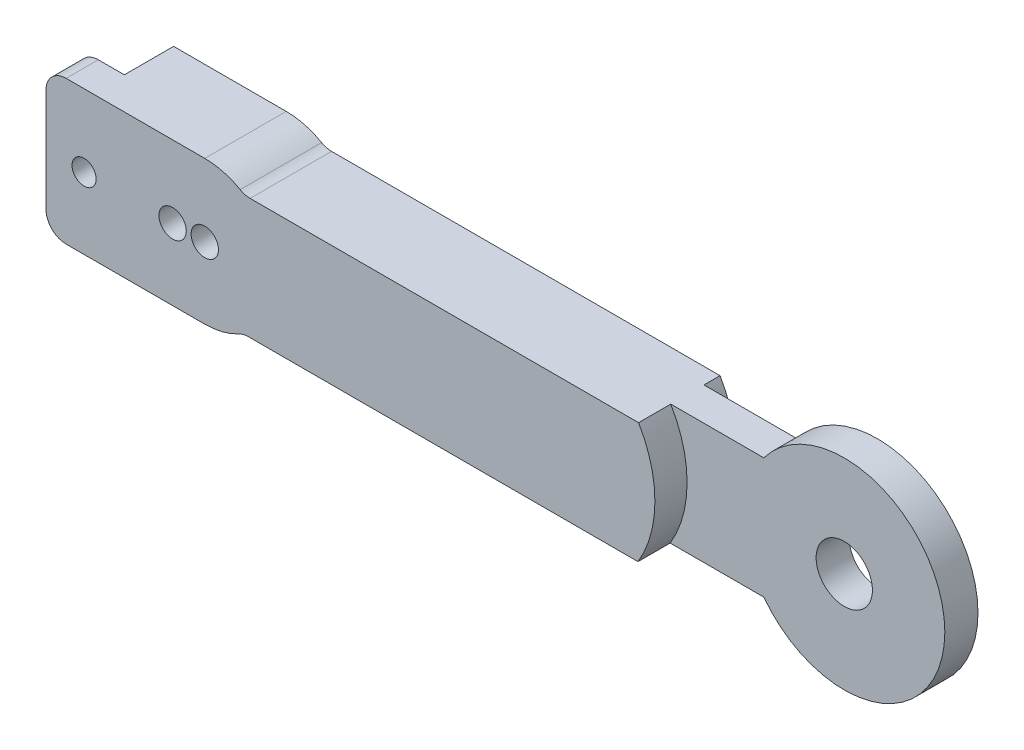
ISO-10303-21;
HEADER;
FILE_DESCRIPTION(('STEP AP214'),'2;1');
FILE_NAME('part.step','',(''),(''),'','','');
FILE_SCHEMA(('AUTOMOTIVE_DESIGN { 1 0 10303 214 1 1 1 1 }'));
ENDSEC;
DATA;
#1=APPLICATION_CONTEXT('core data for automotive mechanical design processes');
#2=APPLICATION_PROTOCOL_DEFINITION('international standard','automotive_design',2000,#1);
#3=PRODUCT_CONTEXT('',#1,'mechanical');
#4=PRODUCT('Part','Part','',(#3));
#5=PRODUCT_RELATED_PRODUCT_CATEGORY('part','',(#4));
#6=PRODUCT_DEFINITION_FORMATION('','',#4);
#7=PRODUCT_DEFINITION_CONTEXT('part definition',#1,'design');
#8=PRODUCT_DEFINITION('design','',#6,#7);
#9=PRODUCT_DEFINITION_SHAPE('','',#8);
#10=(LENGTH_UNIT() NAMED_UNIT(*) SI_UNIT(.MILLI.,.METRE.));
#11=(NAMED_UNIT(*) PLANE_ANGLE_UNIT() SI_UNIT($,.RADIAN.));
#12=(NAMED_UNIT(*) SI_UNIT($,.STERADIAN.) SOLID_ANGLE_UNIT());
#13=UNCERTAINTY_MEASURE_WITH_UNIT(LENGTH_MEASURE(1.E-05),#10,'distance_accuracy_value','');
#14=(GEOMETRIC_REPRESENTATION_CONTEXT(3) GLOBAL_UNCERTAINTY_ASSIGNED_CONTEXT((#13)) GLOBAL_UNIT_ASSIGNED_CONTEXT((#10,
#11,#12)) REPRESENTATION_CONTEXT('',''));
#15=CARTESIAN_POINT('',(0.,0.,0.));
#16=DIRECTION('',(0.,0.,1.));
#17=DIRECTION('',(1.,0.,0.));
#18=AXIS2_PLACEMENT_3D('',#15,#16,#17);
#19=CARTESIAN_POINT('',(14.,3.925,4.125));
#20=DIRECTION('',(0.,0.,-1.));
#21=DIRECTION('',(-1.,0.,0.));
#22=AXIS2_PLACEMENT_3D('',#19,#20,#21);
#23=CYLINDRICAL_SURFACE('',#22,8.925);
#24=DIRECTION('',(0.,0.,-1.));
#25=VECTOR('',#24,1.);
#26=CARTESIAN_POINT('',(18.2268147702944,-3.93564004376367,4.125));
#27=LINE('',#26,#25);
#28=CARTESIAN_POINT('',(18.2268147702944,-3.93564004376367,-2.));
#29=VERTEX_POINT('',#28);
#30=CARTESIAN_POINT('',(18.2268147702944,-3.93564004376367,8.125));
#31=VERTEX_POINT('',#30);
#32=EDGE_CURVE('E55',#29,#31,#27,.F.);
#33=ORIENTED_EDGE('',*,*,#32,.T.);
#34=CARTESIAN_POINT('',(14.,3.925,8.125));
#35=DIRECTION('',(0.,0.,1.));
#36=DIRECTION('',(1.,0.,0.));
#37=AXIS2_PLACEMENT_3D('',#34,#35,#36);
#38=CIRCLE('',#37,8.925);
#39=CARTESIAN_POINT('',(14.,-5.,8.125));
#40=VERTEX_POINT('',#39);
#41=EDGE_CURVE('E347',#40,#31,#38,.T.);
#42=ORIENTED_EDGE('',*,*,#41,.F.);
#43=DIRECTION('',(0.,0.,-1.));
#44=VECTOR('',#43,1.);
#45=CARTESIAN_POINT('',(14.,-5.,4.125));
#46=LINE('',#45,#44);
#47=CARTESIAN_POINT('',(14.,-5.,-2.));
#48=VERTEX_POINT('',#47);
#49=EDGE_CURVE('E513',#40,#48,#46,.T.);
#50=ORIENTED_EDGE('',*,*,#49,.T.);
#51=CARTESIAN_POINT('',(14.,3.925,-2.));
#52=DIRECTION('',(0.,0.,-1.));
#53=DIRECTION('',(-1.,0.,0.));
#54=AXIS2_PLACEMENT_3D('',#51,#52,#53);
#55=CIRCLE('',#54,8.925);
#56=EDGE_CURVE('E423',#29,#48,#55,.T.);
#57=ORIENTED_EDGE('',*,*,#56,.F.);
#58=EDGE_LOOP('',(#33,#42,#50,#57));
#59=FACE_BOUND('',#58,.T.);
#60=ADVANCED_FACE('F45',(#59),#23,.T.);
#61=CARTESIAN_POINT('',(14.,3.925,8.125));
#62=DIRECTION('',(0.,0.,1.));
#63=DIRECTION('',(1.,0.,0.));
#64=AXIS2_PLACEMENT_3D('',#61,#62,#63);
#65=CIRCLE('',#64,8.925);
#66=CARTESIAN_POINT('',(18.4035865959508,11.6879923413567,8.125));
#67=VERTEX_POINT('',#66);
#68=CARTESIAN_POINT('',(14.,12.85,8.125));
#69=VERTEX_POINT('',#68);
#70=EDGE_CURVE('E351',#67,#69,#65,.T.);
#71=ORIENTED_EDGE('',*,*,#70,.F.);
#72=DIRECTION('',(0.,0.,-1.));
#73=VECTOR('',#72,1.);
#74=CARTESIAN_POINT('',(18.4035865959508,11.6879923413567,4.125));
#75=LINE('',#74,#73);
#76=CARTESIAN_POINT('',(18.4035865959508,11.6879923413567,-2.));
#77=VERTEX_POINT('',#76);
#78=EDGE_CURVE('E62',#67,#77,#75,.T.);
#79=ORIENTED_EDGE('',*,*,#78,.T.);
#80=CARTESIAN_POINT('',(14.,12.85,-2.));
#81=VERTEX_POINT('',#80);
#82=EDGE_CURVE('E424',#81,#77,#55,.T.);
#83=ORIENTED_EDGE('',*,*,#82,.F.);
#84=DIRECTION('',(0.,0.,-1.));
#85=VECTOR('',#84,1.);
#86=CARTESIAN_POINT('',(14.,12.85,4.125));
#87=LINE('',#86,#85);
#88=EDGE_CURVE('E510',#69,#81,#87,.T.);
#89=ORIENTED_EDGE('',*,*,#88,.F.);
#90=EDGE_LOOP('',(#71,#79,#83,#89));
#91=FACE_BOUND('',#90,.T.);
#92=ADVANCED_FACE('F562',(#91),#23,.T.);
#93=CARTESIAN_POINT('',(89.4999999999934,3.8625,0.));
#94=DIRECTION('',(0.,0.,-1.));
#95=DIRECTION('',(-1.,0.,0.));
#96=AXIS2_PLACEMENT_3D('',#93,#94,#95);
#97=PLANE('',#96);
#98=CARTESIAN_POINT('',(89.4999999999934,3.8625,0.));
#99=DIRECTION('',(0.,0.,-1.));
#100=DIRECTION('',(-1.,0.,0.));
#101=AXIS2_PLACEMENT_3D('',#98,#99,#100);
#102=CIRCLE('',#101,3.50000000000001);
#103=CARTESIAN_POINT('',(85.9999999999934,3.8625,0.));
#104=VERTEX_POINT('',#103);
#105=EDGE_CURVE('E49',#104,#104,#102,.T.);
#106=ORIENTED_EDGE('',*,*,#105,.F.);
#107=EDGE_LOOP('',(#106));
#108=FACE_BOUND('',#107,.T.);
#109=DIRECTION('',(1.,0.,0.));
#110=VECTOR('',#109,1.);
#111=CARTESIAN_POINT('',(89.5,-3.63750000000001,0.));
#112=LINE('',#111,#110);
#113=CARTESIAN_POINT('',(67.8573018061817,-3.6375,0.));
#114=VERTEX_POINT('',#113);
#115=CARTESIAN_POINT('',(79.4999999999934,-3.63750000000001,0.));
#116=VERTEX_POINT('',#115);
#117=EDGE_CURVE('E305',#114,#116,#112,.T.);
#118=ORIENTED_EDGE('',*,*,#117,.F.);
#119=CARTESIAN_POINT('',(55.3074745937747,3.925,0.));
#120=DIRECTION('',(0.,0.,-1.));
#121=DIRECTION('',(-1.,0.,0.));
#122=AXIS2_PLACEMENT_3D('',#119,#120,#121);
#123=CIRCLE('',#122,14.6522888761883);
#124=CARTESIAN_POINT('',(67.931783012903,11.3625,0.));
#125=VERTEX_POINT('',#124);
#126=EDGE_CURVE('E258',#125,#114,#123,.T.);
#127=ORIENTED_EDGE('',*,*,#126,.F.);
#128=DIRECTION('',(-1.,0.,0.));
#129=VECTOR('',#128,1.);
#130=CARTESIAN_POINT('',(89.5,11.3625,0.));
#131=LINE('',#130,#129);
#132=CARTESIAN_POINT('',(79.4999999999934,11.3625,0.));
#133=VERTEX_POINT('',#132);
#134=EDGE_CURVE('E309',#133,#125,#131,.T.);
#135=ORIENTED_EDGE('',*,*,#134,.F.);
#136=CARTESIAN_POINT('',(89.4999999999934,3.8625,0.));
#137=DIRECTION('',(0.,0.,-1.));
#138=DIRECTION('',(-1.,0.,0.));
#139=AXIS2_PLACEMENT_3D('',#136,#137,#138);
#140=CIRCLE('',#139,12.5);
#141=EDGE_CURVE('E287',#133,#116,#140,.T.);
#142=ORIENTED_EDGE('',*,*,#141,.T.);
#143=EDGE_LOOP('',(#118,#127,#135,#142));
#144=FACE_BOUND('',#143,.T.);
#145=ADVANCED_FACE('F549',(#108,#144),#97,.T.);
#146=CARTESIAN_POINT('',(0.,-5.,4.125));
#147=DIRECTION('',(1.,0.,0.));
#148=DIRECTION('',(0.,1.,0.));
#149=AXIS2_PLACEMENT_3D('',#146,#147,#148);
#150=PLANE('',#149);
#151=DIRECTION('',(0.,0.,-1.));
#152=VECTOR('',#151,1.);
#153=CARTESIAN_POINT('',(0.,0.,4.125));
#154=LINE('',#153,#152);
#155=CARTESIAN_POINT('',(0.,0.,4.125));
#156=VERTEX_POINT('',#155);
#157=CARTESIAN_POINT('',(0.,0.,0.));
#158=VERTEX_POINT('',#157);
#159=EDGE_CURVE('E481',#156,#158,#154,.T.);
#160=ORIENTED_EDGE('',*,*,#159,.T.);
#161=DIRECTION('',(0.,1.,0.));
#162=VECTOR('',#161,1.);
#163=CARTESIAN_POINT('',(0.,1.1125,0.));
#164=LINE('',#163,#162);
#165=CARTESIAN_POINT('',(0.,1.1125,0.));
#166=VERTEX_POINT('',#165);
#167=EDGE_CURVE('E397',#158,#166,#164,.T.);
#168=ORIENTED_EDGE('',*,*,#167,.T.);
#169=DIRECTION('',(0.,0.,1.));
#170=VECTOR('',#169,1.);
#171=CARTESIAN_POINT('',(0.,1.1125,-2.));
#172=LINE('',#171,#170);
#173=CARTESIAN_POINT('',(0.,1.1125,-2.));
#174=VERTEX_POINT('',#173);
#175=EDGE_CURVE('E455',#174,#166,#172,.T.);
#176=ORIENTED_EDGE('',*,*,#175,.F.);
#177=DIRECTION('',(0.,1.,0.));
#178=VECTOR('',#177,1.);
#179=CARTESIAN_POINT('',(0.,-5.,-2.));
#180=LINE('',#179,#178);
#181=CARTESIAN_POINT('',(0.,-5.,-2.));
#182=VERTEX_POINT('',#181);
#183=EDGE_CURVE('E402',#182,#174,#180,.T.);
#184=ORIENTED_EDGE('',*,*,#183,.F.);
#185=DIRECTION('',(0.,0.,-1.));
#186=VECTOR('',#185,1.);
#187=CARTESIAN_POINT('',(0.,-5.,4.125));
#188=LINE('',#187,#186);
#189=CARTESIAN_POINT('',(0.,-5.,4.125));
#190=VERTEX_POINT('',#189);
#191=EDGE_CURVE('E517',#190,#182,#188,.T.);
#192=ORIENTED_EDGE('',*,*,#191,.F.);
#193=DIRECTION('',(0.,-1.,0.));
#194=VECTOR('',#193,1.);
#195=CARTESIAN_POINT('',(0.,-5.,4.125));
#196=LINE('',#195,#194);
#197=EDGE_CURVE('E460',#156,#190,#196,.T.);
#198=ORIENTED_EDGE('',*,*,#197,.F.);
#199=EDGE_LOOP('',(#160,#168,#176,#184,#192,#198));
#200=FACE_BOUND('',#199,.T.);
#201=ADVANCED_FACE('F591',(#200),#150,.F.);
#202=CARTESIAN_POINT('',(14.,-5.,4.125));
#203=DIRECTION('',(0.,1.,0.));
#204=DIRECTION('',(-1.,0.,0.));
#205=AXIS2_PLACEMENT_3D('',#202,#203,#204);
#206=PLANE('',#205);
#207=ORIENTED_EDGE('',*,*,#191,.T.);
#208=DIRECTION('',(-1.,0.,0.));
#209=VECTOR('',#208,1.);
#210=CARTESIAN_POINT('',(14.,-5.,-2.));
#211=LINE('',#210,#209);
#212=EDGE_CURVE('E398',#48,#182,#211,.T.);
#213=ORIENTED_EDGE('',*,*,#212,.F.);
#214=ORIENTED_EDGE('',*,*,#49,.F.);
#215=DIRECTION('',(1.,0.,0.));
#216=VECTOR('',#215,1.);
#217=CARTESIAN_POINT('',(0.,-5.,8.125));
#218=LINE('',#217,#216);
#219=CARTESIAN_POINT('',(-3.23886907207625,-5.,8.125));
#220=VERTEX_POINT('',#219);
#221=EDGE_CURVE('E343',#220,#40,#218,.T.);
#222=ORIENTED_EDGE('',*,*,#221,.F.);
#223=DIRECTION('',(0.,0.,-1.));
#224=VECTOR('',#223,1.);
#225=CARTESIAN_POINT('',(-3.23886907207625,-5.,8.125));
#226=LINE('',#225,#224);
#227=CARTESIAN_POINT('',(-3.23886907207625,-5.,4.125));
#228=VERTEX_POINT('',#227);
#229=EDGE_CURVE('E367',#220,#228,#226,.T.);
#230=ORIENTED_EDGE('',*,*,#229,.T.);
#231=DIRECTION('',(1.,0.,0.));
#232=VECTOR('',#231,1.);
#233=CARTESIAN_POINT('',(-3.23886907207625,-5.,4.125));
#234=LINE('',#233,#232);
#235=EDGE_CURVE('E348',#228,#190,#234,.T.);
#236=ORIENTED_EDGE('',*,*,#235,.T.);
#237=EDGE_LOOP('',(#207,#213,#214,#222,#230,#236));
#238=FACE_BOUND('',#237,.T.);
#239=ADVANCED_FACE('F585',(#238),#206,.F.);
#240=CARTESIAN_POINT('',(0.,12.85,4.125));
#241=DIRECTION('',(0.,-1.,0.));
#242=DIRECTION('',(1.,0.,0.));
#243=AXIS2_PLACEMENT_3D('',#240,#241,#242);
#244=PLANE('',#243);
#245=ORIENTED_EDGE('',*,*,#88,.T.);
#246=DIRECTION('',(1.,0.,0.));
#247=VECTOR('',#246,1.);
#248=CARTESIAN_POINT('',(0.,12.85,-2.));
#249=LINE('',#248,#247);
#250=CARTESIAN_POINT('',(0.,12.85,-2.));
#251=VERTEX_POINT('',#250);
#252=EDGE_CURVE('E419',#251,#81,#249,.T.);
#253=ORIENTED_EDGE('',*,*,#252,.F.);
#254=DIRECTION('',(0.,0.,-1.));
#255=VECTOR('',#254,1.);
#256=CARTESIAN_POINT('',(0.,12.85,4.125));
#257=LINE('',#256,#255);
#258=CARTESIAN_POINT('',(0.,12.85,4.125));
#259=VERTEX_POINT('',#258);
#260=EDGE_CURVE('E507',#259,#251,#257,.T.);
#261=ORIENTED_EDGE('',*,*,#260,.F.);
#262=DIRECTION('',(-1.,0.,0.));
#263=VECTOR('',#262,1.);
#264=CARTESIAN_POINT('',(0.,12.85,4.125));
#265=LINE('',#264,#263);
#266=CARTESIAN_POINT('',(-3.23886907207625,12.85,4.125));
#267=VERTEX_POINT('',#266);
#268=EDGE_CURVE('E339',#259,#267,#265,.T.);
#269=ORIENTED_EDGE('',*,*,#268,.T.);
#270=DIRECTION('',(0.,0.,-1.));
#271=VECTOR('',#270,1.);
#272=CARTESIAN_POINT('',(-3.23886907207625,12.85,8.125));
#273=LINE('',#272,#271);
#274=CARTESIAN_POINT('',(-3.23886907207625,12.85,8.125));
#275=VERTEX_POINT('',#274);
#276=EDGE_CURVE('E393',#275,#267,#273,.T.);
#277=ORIENTED_EDGE('',*,*,#276,.F.);
#278=DIRECTION('',(-1.,0.,0.));
#279=VECTOR('',#278,1.);
#280=CARTESIAN_POINT('',(14.,12.85,8.125));
#281=LINE('',#280,#279);
#282=EDGE_CURVE('E354',#69,#275,#281,.T.);
#283=ORIENTED_EDGE('',*,*,#282,.F.);
#284=EDGE_LOOP('',(#245,#253,#261,#269,#277,#283));
#285=FACE_BOUND('',#284,.T.);
#286=ADVANCED_FACE('F568',(#285),#244,.F.);
#287=CARTESIAN_POINT('',(0.,7.85,4.125));
#288=DIRECTION('',(1.,0.,0.));
#289=DIRECTION('',(0.,0.,-1.));
#290=AXIS2_PLACEMENT_3D('',#287,#288,#289);
#291=PLANE('',#290);
#292=ORIENTED_EDGE('',*,*,#260,.T.);
#293=DIRECTION('',(0.,1.,0.));
#294=VECTOR('',#293,1.);
#295=CARTESIAN_POINT('',(0.,6.7375,-2.));
#296=LINE('',#295,#294);
#297=CARTESIAN_POINT('',(0.,6.7375,-2.));
#298=VERTEX_POINT('',#297);
#299=EDGE_CURVE('E415',#298,#251,#296,.T.);
#300=ORIENTED_EDGE('',*,*,#299,.F.);
#301=DIRECTION('',(0.,0.,1.));
#302=VECTOR('',#301,1.);
#303=CARTESIAN_POINT('',(0.,6.7375,-2.));
#304=LINE('',#303,#302);
#305=CARTESIAN_POINT('',(0.,6.7375,0.));
#306=VERTEX_POINT('',#305);
#307=EDGE_CURVE('E428',#298,#306,#304,.T.);
#308=ORIENTED_EDGE('',*,*,#307,.T.);
#309=DIRECTION('',(0.,1.,0.));
#310=VECTOR('',#309,1.);
#311=CARTESIAN_POINT('',(0.,7.85,0.));
#312=LINE('',#311,#310);
#313=CARTESIAN_POINT('',(0.,7.85,0.));
#314=VERTEX_POINT('',#313);
#315=EDGE_CURVE('E403',#306,#314,#312,.T.);
#316=ORIENTED_EDGE('',*,*,#315,.T.);
#317=DIRECTION('',(0.,0.,-1.));
#318=VECTOR('',#317,1.);
#319=CARTESIAN_POINT('',(0.,7.85,4.125));
#320=LINE('',#319,#318);
#321=CARTESIAN_POINT('',(0.,7.85,4.125));
#322=VERTEX_POINT('',#321);
#323=EDGE_CURVE('E503',#322,#314,#320,.T.);
#324=ORIENTED_EDGE('',*,*,#323,.F.);
#325=DIRECTION('',(0.,-1.,0.));
#326=VECTOR('',#325,1.);
#327=CARTESIAN_POINT('',(0.,7.85,4.125));
#328=LINE('',#327,#326);
#329=EDGE_CURVE('E464',#259,#322,#328,.T.);
#330=ORIENTED_EDGE('',*,*,#329,.F.);
#331=EDGE_LOOP('',(#292,#300,#308,#316,#324,#330));
#332=FACE_BOUND('',#331,.T.);
#333=ADVANCED_FACE('F684',(#332),#291,.F.);
#334=CARTESIAN_POINT('',(14.,7.85,4.125));
#335=DIRECTION('',(0.,1.,0.));
#336=DIRECTION('',(-1.,0.,0.));
#337=AXIS2_PLACEMENT_3D('',#334,#335,#336);
#338=PLANE('',#337);
#339=DIRECTION('',(1.,0.,0.));
#340=VECTOR('',#339,1.);
#341=CARTESIAN_POINT('',(14.,7.85,0.));
#342=LINE('',#341,#340);
#343=CARTESIAN_POINT('',(14.,7.85,0.));
#344=VERTEX_POINT('',#343);
#345=EDGE_CURVE('E459',#314,#344,#342,.T.);
#346=ORIENTED_EDGE('',*,*,#345,.T.);
#347=DIRECTION('',(0.,0.,-1.));
#348=VECTOR('',#347,1.);
#349=CARTESIAN_POINT('',(14.,7.85,4.125));
#350=LINE('',#349,#348);
#351=CARTESIAN_POINT('',(14.,7.85,4.125));
#352=VERTEX_POINT('',#351);
#353=EDGE_CURVE('E499',#352,#344,#350,.T.);
#354=ORIENTED_EDGE('',*,*,#353,.F.);
#355=DIRECTION('',(1.,0.,0.));
#356=VECTOR('',#355,1.);
#357=CARTESIAN_POINT('',(14.,7.85,4.125));
#358=LINE('',#357,#356);
#359=EDGE_CURVE('E469',#322,#352,#358,.T.);
#360=ORIENTED_EDGE('',*,*,#359,.F.);
#361=ORIENTED_EDGE('',*,*,#323,.T.);
#362=EDGE_LOOP('',(#346,#354,#360,#361));
#363=FACE_BOUND('',#362,.T.);
#364=ADVANCED_FACE('F681',(#363),#338,.F.);
#365=CARTESIAN_POINT('',(14.,3.925,4.125));
#366=DIRECTION('',(0.,0.,-1.));
#367=DIRECTION('',(-1.,0.,0.));
#368=AXIS2_PLACEMENT_3D('',#365,#366,#367);
#369=CYLINDRICAL_SURFACE('',#368,3.925);
#370=CARTESIAN_POINT('',(14.,3.925,0.));
#371=DIRECTION('',(0.,0.,-1.));
#372=DIRECTION('',(1.,0.,0.));
#373=AXIS2_PLACEMENT_3D('',#370,#371,#372);
#374=CIRCLE('',#373,3.925);
#375=CARTESIAN_POINT('',(14.,0.,0.));
#376=VERTEX_POINT('',#375);
#377=EDGE_CURVE('E485',#344,#376,#374,.T.);
#378=ORIENTED_EDGE('',*,*,#377,.T.);
#379=DIRECTION('',(0.,0.,-1.));
#380=VECTOR('',#379,1.);
#381=CARTESIAN_POINT('',(14.,0.,4.125));
#382=LINE('',#381,#380);
#383=CARTESIAN_POINT('',(14.,0.,4.125));
#384=VERTEX_POINT('',#383);
#385=EDGE_CURVE('E495',#384,#376,#382,.T.);
#386=ORIENTED_EDGE('',*,*,#385,.F.);
#387=CARTESIAN_POINT('',(14.,3.925,4.125));
#388=DIRECTION('',(0.,0.,-1.));
#389=DIRECTION('',(1.,0.,0.));
#390=AXIS2_PLACEMENT_3D('',#387,#388,#389);
#391=CIRCLE('',#390,3.925);
#392=EDGE_CURVE('E473',#352,#384,#391,.T.);
#393=ORIENTED_EDGE('',*,*,#392,.F.);
#394=ORIENTED_EDGE('',*,*,#353,.T.);
#395=EDGE_LOOP('',(#378,#386,#393,#394));
#396=FACE_BOUND('',#395,.T.);
#397=ADVANCED_FACE('F677',(#396),#369,.F.);
#398=CARTESIAN_POINT('',(0.,0.,4.125));
#399=DIRECTION('',(0.,-1.,0.));
#400=DIRECTION('',(0.,0.,-1.));
#401=AXIS2_PLACEMENT_3D('',#398,#399,#400);
#402=PLANE('',#401);
#403=DIRECTION('',(-1.,0.,0.));
#404=VECTOR('',#403,1.);
#405=CARTESIAN_POINT('',(0.,0.,0.));
#406=LINE('',#405,#404);
#407=EDGE_CURVE('E465',#376,#158,#406,.T.);
#408=ORIENTED_EDGE('',*,*,#407,.T.);
#409=ORIENTED_EDGE('',*,*,#159,.F.);
#410=DIRECTION('',(-1.,0.,0.));
#411=VECTOR('',#410,1.);
#412=CARTESIAN_POINT('',(0.,0.,4.125));
#413=LINE('',#412,#411);
#414=EDGE_CURVE('E477',#384,#156,#413,.T.);
#415=ORIENTED_EDGE('',*,*,#414,.F.);
#416=ORIENTED_EDGE('',*,*,#385,.T.);
#417=EDGE_LOOP('',(#408,#409,#415,#416));
#418=FACE_BOUND('',#417,.T.);
#419=ADVANCED_FACE('F674',(#418),#402,.F.);
#420=CARTESIAN_POINT('',(14.,3.925,4.125));
#421=DIRECTION('',(0.,0.,1.));
#422=DIRECTION('',(1.,0.,0.));
#423=AXIS2_PLACEMENT_3D('',#420,#421,#422);
#424=PLANE('',#423);
#425=DIRECTION('',(-1.,0.,0.));
#426=VECTOR('',#425,1.);
#427=CARTESIAN_POINT('',(89.5,11.3625,4.125));
#428=LINE('',#427,#426);
#429=CARTESIAN_POINT('',(79.4999999999934,11.3625,4.125));
#430=VERTEX_POINT('',#429);
#431=CARTESIAN_POINT('',(67.931783012903,11.3625,4.125));
#432=VERTEX_POINT('',#431);
#433=EDGE_CURVE('E313',#430,#432,#428,.T.);
#434=ORIENTED_EDGE('',*,*,#433,.T.);
#435=CARTESIAN_POINT('',(55.3074745937747,3.925,4.125));
#436=DIRECTION('',(0.,0.,1.));
#437=DIRECTION('',(1.,0.,0.));
#438=AXIS2_PLACEMENT_3D('',#435,#436,#437);
#439=CIRCLE('',#438,14.6522888761883);
#440=CARTESIAN_POINT('',(67.8573018061817,-3.6375,4.125));
#441=VERTEX_POINT('',#440);
#442=EDGE_CURVE('E245',#441,#432,#439,.T.);
#443=ORIENTED_EDGE('',*,*,#442,.F.);
#444=DIRECTION('',(1.,0.,0.));
#445=VECTOR('',#444,1.);
#446=CARTESIAN_POINT('',(89.5,-3.63750000000001,4.125));
#447=LINE('',#446,#445);
#448=CARTESIAN_POINT('',(79.4999999999934,-3.63750000000001,4.125));
#449=VERTEX_POINT('',#448);
#450=EDGE_CURVE('E308',#441,#449,#447,.T.);
#451=ORIENTED_EDGE('',*,*,#450,.T.);
#452=CARTESIAN_POINT('',(89.4999999999934,3.8625,4.125));
#453=DIRECTION('',(0.,0.,1.));
#454=DIRECTION('',(1.,0.,0.));
#455=AXIS2_PLACEMENT_3D('',#452,#453,#454);
#456=CIRCLE('',#455,12.5);
#457=EDGE_CURVE('E266',#430,#449,#456,.F.);
#458=ORIENTED_EDGE('',*,*,#457,.F.);
#459=EDGE_LOOP('',(#434,#443,#451,#458));
#460=FACE_BOUND('',#459,.T.);
#461=CARTESIAN_POINT('',(89.4999999999934,3.8625,4.125));
#462=DIRECTION('',(0.,0.,1.));
#463=DIRECTION('',(1.,0.,0.));
#464=AXIS2_PLACEMENT_3D('',#461,#462,#463);
#465=CIRCLE('',#464,3.50000000000001);
#466=CARTESIAN_POINT('',(92.9999999999934,3.8625,4.125));
#467=VERTEX_POINT('',#466);
#468=EDGE_CURVE('E301',#467,#467,#465,.T.);
#469=ORIENTED_EDGE('',*,*,#468,.F.);
#470=EDGE_LOOP('',(#469));
#471=FACE_BOUND('',#470,.T.);
#472=ADVANCED_FACE('F536',(#460,#471),#424,.T.);
#473=CARTESIAN_POINT('',(14.,1.1125,-2.));
#474=DIRECTION('',(0.,-1.,0.));
#475=DIRECTION('',(0.,0.,-1.));
#476=AXIS2_PLACEMENT_3D('',#473,#474,#475);
#477=PLANE('',#476);
#478=DIRECTION('',(1.,0.,0.));
#479=VECTOR('',#478,1.);
#480=CARTESIAN_POINT('',(14.,1.1125,0.));
#481=LINE('',#480,#479);
#482=CARTESIAN_POINT('',(14.,1.1125,0.));
#483=VERTEX_POINT('',#482);
#484=EDGE_CURVE('E431',#166,#483,#481,.T.);
#485=ORIENTED_EDGE('',*,*,#484,.T.);
#486=DIRECTION('',(0.,0.,1.));
#487=VECTOR('',#486,1.);
#488=CARTESIAN_POINT('',(14.,1.1125,-2.));
#489=LINE('',#488,#487);
#490=CARTESIAN_POINT('',(14.,1.1125,-2.));
#491=VERTEX_POINT('',#490);
#492=EDGE_CURVE('E451',#491,#483,#489,.T.);
#493=ORIENTED_EDGE('',*,*,#492,.F.);
#494=DIRECTION('',(1.,0.,0.));
#495=VECTOR('',#494,1.);
#496=CARTESIAN_POINT('',(14.,1.1125,-2.));
#497=LINE('',#496,#495);
#498=EDGE_CURVE('E406',#174,#491,#497,.T.);
#499=ORIENTED_EDGE('',*,*,#498,.F.);
#500=ORIENTED_EDGE('',*,*,#175,.T.);
#501=EDGE_LOOP('',(#485,#493,#499,#500));
#502=FACE_BOUND('',#501,.T.);
#503=ADVANCED_FACE('F667',(#502),#477,.F.);
#504=CARTESIAN_POINT('',(14.,3.925,-2.));
#505=DIRECTION('',(0.,0.,1.));
#506=DIRECTION('',(1.,0.,0.));
#507=AXIS2_PLACEMENT_3D('',#504,#505,#506);
#508=CYLINDRICAL_SURFACE('',#507,2.8125);
#509=CARTESIAN_POINT('',(14.,3.925,0.));
#510=DIRECTION('',(0.,0.,1.));
#511=DIRECTION('',(-1.,0.,0.));
#512=AXIS2_PLACEMENT_3D('',#509,#510,#511);
#513=CIRCLE('',#512,2.8125);
#514=CARTESIAN_POINT('',(14.,6.7375,0.));
#515=VERTEX_POINT('',#514);
#516=EDGE_CURVE('E434',#483,#515,#513,.T.);
#517=ORIENTED_EDGE('',*,*,#516,.T.);
#518=DIRECTION('',(0.,0.,1.));
#519=VECTOR('',#518,1.);
#520=CARTESIAN_POINT('',(14.,6.7375,-2.));
#521=LINE('',#520,#519);
#522=CARTESIAN_POINT('',(14.,6.7375,-2.));
#523=VERTEX_POINT('',#522);
#524=EDGE_CURVE('E447',#523,#515,#521,.T.);
#525=ORIENTED_EDGE('',*,*,#524,.F.);
#526=CARTESIAN_POINT('',(14.,3.925,-2.));
#527=DIRECTION('',(0.,0.,1.));
#528=DIRECTION('',(-1.,0.,0.));
#529=AXIS2_PLACEMENT_3D('',#526,#527,#528);
#530=CIRCLE('',#529,2.8125);
#531=EDGE_CURVE('E409',#491,#523,#530,.T.);
#532=ORIENTED_EDGE('',*,*,#531,.F.);
#533=ORIENTED_EDGE('',*,*,#492,.T.);
#534=EDGE_LOOP('',(#517,#525,#532,#533));
#535=FACE_BOUND('',#534,.T.);
#536=ADVANCED_FACE('F663',(#535),#508,.F.);
#537=CARTESIAN_POINT('',(14.,6.7375,-2.));
#538=DIRECTION('',(0.,1.,0.));
#539=DIRECTION('',(0.,0.,1.));
#540=AXIS2_PLACEMENT_3D('',#537,#538,#539);
#541=PLANE('',#540);
#542=DIRECTION('',(-1.,0.,0.));
#543=VECTOR('',#542,1.);
#544=CARTESIAN_POINT('',(14.,6.7375,0.));
#545=LINE('',#544,#543);
#546=EDGE_CURVE('E437',#515,#306,#545,.T.);
#547=ORIENTED_EDGE('',*,*,#546,.T.);
#548=ORIENTED_EDGE('',*,*,#307,.F.);
#549=DIRECTION('',(-1.,0.,0.));
#550=VECTOR('',#549,1.);
#551=CARTESIAN_POINT('',(14.,6.7375,-2.));
#552=LINE('',#551,#550);
#553=EDGE_CURVE('E412',#523,#298,#552,.T.);
#554=ORIENTED_EDGE('',*,*,#553,.F.);
#555=ORIENTED_EDGE('',*,*,#524,.T.);
#556=EDGE_LOOP('',(#547,#548,#554,#555));
#557=FACE_BOUND('',#556,.T.);
#558=ADVANCED_FACE('F658',(#557),#541,.F.);
#559=CARTESIAN_POINT('',(14.,3.925,-2.));
#560=DIRECTION('',(0.,0.,-1.));
#561=DIRECTION('',(-1.,0.,0.));
#562=AXIS2_PLACEMENT_3D('',#559,#560,#561);
#563=PLANE('',#562);
#564=ORIENTED_EDGE('',*,*,#212,.T.);
#565=ORIENTED_EDGE('',*,*,#183,.T.);
#566=ORIENTED_EDGE('',*,*,#498,.T.);
#567=ORIENTED_EDGE('',*,*,#531,.T.);
#568=ORIENTED_EDGE('',*,*,#553,.T.);
#569=ORIENTED_EDGE('',*,*,#299,.T.);
#570=ORIENTED_EDGE('',*,*,#252,.T.);
#571=ORIENTED_EDGE('',*,*,#82,.T.);
#572=CARTESIAN_POINT('',(19.6370842418754,13.8625,-2.));
#573=DIRECTION('',(0.,0.,-1.));
#574=DIRECTION('',(-1.,0.,0.));
#575=AXIS2_PLACEMENT_3D('',#572,#573,#574);
#576=CIRCLE('',#575,2.5);
#577=CARTESIAN_POINT('',(19.6370842418754,11.3625,-2.));
#578=VERTEX_POINT('',#577);
#579=EDGE_CURVE('E262',#578,#77,#576,.T.);
#580=ORIENTED_EDGE('',*,*,#579,.F.);
#581=DIRECTION('',(1.,0.,0.));
#582=VECTOR('',#581,1.);
#583=CARTESIAN_POINT('',(19.6370842418754,11.3625,-2.));
#584=LINE('',#583,#582);
#585=CARTESIAN_POINT('',(67.931783012903,11.3625,-2.));
#586=VERTEX_POINT('',#585);
#587=EDGE_CURVE('E225',#578,#586,#584,.T.);
#588=ORIENTED_EDGE('',*,*,#587,.T.);
#589=CARTESIAN_POINT('',(55.3074745937747,3.925,-2.));
#590=DIRECTION('',(0.,0.,-1.));
#591=DIRECTION('',(-1.,0.,0.));
#592=AXIS2_PLACEMENT_3D('',#589,#590,#591);
#593=CIRCLE('',#592,14.6522888761883);
#594=CARTESIAN_POINT('',(67.8573018061817,-3.63750000000001,-2.));
#595=VERTEX_POINT('',#594);
#596=EDGE_CURVE('E269',#586,#595,#593,.T.);
#597=ORIENTED_EDGE('',*,*,#596,.T.);
#598=DIRECTION('',(-1.,0.,0.));
#599=VECTOR('',#598,1.);
#600=CARTESIAN_POINT('',(67.8573018061817,-3.63750000000001,-2.));
#601=LINE('',#600,#599);
#602=CARTESIAN_POINT('',(19.4107964986682,-3.63749999999999,-2.));
#603=VERTEX_POINT('',#602);
#604=EDGE_CURVE('E272',#595,#603,#601,.T.);
#605=ORIENTED_EDGE('',*,*,#604,.T.);
#606=CARTESIAN_POINT('',(19.4107964986682,-6.13749999999999,-2.));
#607=DIRECTION('',(0.,0.,-1.));
#608=DIRECTION('',(-1.,0.,0.));
#609=AXIS2_PLACEMENT_3D('',#606,#607,#608);
#610=CIRCLE('',#609,2.5);
#611=EDGE_CURVE('E276',#29,#603,#610,.T.);
#612=ORIENTED_EDGE('',*,*,#611,.F.);
#613=ORIENTED_EDGE('',*,*,#56,.T.);
#614=EDGE_LOOP('',(#564,#565,#566,#567,#568,#569,#570,#571,#580,#588,#597,#605,#612,#613));
#615=FACE_BOUND('',#614,.T.);
#616=ADVANCED_FACE('F556',(#615),#563,.T.);
#617=CARTESIAN_POINT('',(14.,3.925,0.));
#618=DIRECTION('',(0.,0.,-1.));
#619=DIRECTION('',(-1.,0.,0.));
#620=AXIS2_PLACEMENT_3D('',#617,#618,#619);
#621=PLANE('',#620);
#622=ORIENTED_EDGE('',*,*,#407,.F.);
#623=ORIENTED_EDGE('',*,*,#377,.F.);
#624=ORIENTED_EDGE('',*,*,#345,.F.);
#625=ORIENTED_EDGE('',*,*,#315,.F.);
#626=ORIENTED_EDGE('',*,*,#546,.F.);
#627=ORIENTED_EDGE('',*,*,#516,.F.);
#628=ORIENTED_EDGE('',*,*,#484,.F.);
#629=ORIENTED_EDGE('',*,*,#167,.F.);
#630=EDGE_LOOP('',(#622,#623,#624,#625,#626,#627,#628,#629));
#631=FACE_BOUND('',#630,.T.);
#632=ADVANCED_FACE('F649',(#631),#621,.F.);
#633=CARTESIAN_POINT('',(14.,3.925,4.125));
#634=DIRECTION('',(0.,0.,1.));
#635=DIRECTION('',(1.,0.,0.));
#636=AXIS2_PLACEMENT_3D('',#633,#634,#635);
#637=PLANE('',#636);
#638=CARTESIAN_POINT('',(14.,3.8625,4.125));
#639=DIRECTION('',(0.,0.,1.));
#640=DIRECTION('',(1.,0.,0.));
#641=AXIS2_PLACEMENT_3D('',#638,#639,#640);
#642=CIRCLE('',#641,1.7);
#643=CARTESIAN_POINT('',(15.7,3.8625,4.125));
#644=VERTEX_POINT('',#643);
#645=EDGE_CURVE('E331',#644,#644,#642,.T.);
#646=ORIENTED_EDGE('',*,*,#645,.T.);
#647=EDGE_LOOP('',(#646));
#648=FACE_BOUND('',#647,.T.);
#649=CARTESIAN_POINT('',(10.,3.8625,4.125));
#650=DIRECTION('',(0.,0.,1.));
#651=DIRECTION('',(1.,0.,0.));
#652=AXIS2_PLACEMENT_3D('',#649,#650,#651);
#653=CIRCLE('',#652,1.7);
#654=CARTESIAN_POINT('',(11.7,3.8625,4.125));
#655=VERTEX_POINT('',#654);
#656=EDGE_CURVE('E323',#655,#655,#653,.T.);
#657=ORIENTED_EDGE('',*,*,#656,.T.);
#658=EDGE_LOOP('',(#657));
#659=FACE_BOUND('',#658,.T.);
#660=CARTESIAN_POINT('',(-0.999999999999999,3.8625,4.125));
#661=DIRECTION('',(0.,0.,1.));
#662=DIRECTION('',(1.,0.,0.));
#663=AXIS2_PLACEMENT_3D('',#660,#661,#662);
#664=CIRCLE('',#663,1.5);
#665=CARTESIAN_POINT('',(0.5,3.8625,4.125));
#666=VERTEX_POINT('',#665);
#667=EDGE_CURVE('E316',#666,#666,#664,.T.);
#668=ORIENTED_EDGE('',*,*,#667,.T.);
#669=EDGE_LOOP('',(#668));
#670=FACE_BOUND('',#669,.T.);
#671=ORIENTED_EDGE('',*,*,#414,.T.);
#672=ORIENTED_EDGE('',*,*,#197,.T.);
#673=ORIENTED_EDGE('',*,*,#235,.F.);
#674=CARTESIAN_POINT('',(-3.23886907207625,-2.5,4.125));
#675=DIRECTION('',(0.,0.,1.));
#676=DIRECTION('',(1.,0.,0.));
#677=AXIS2_PLACEMENT_3D('',#674,#675,#676);
#678=CIRCLE('',#677,2.5);
#679=CARTESIAN_POINT('',(-5.73886907207625,-2.5,4.125));
#680=VERTEX_POINT('',#679);
#681=EDGE_CURVE('E376',#680,#228,#678,.T.);
#682=ORIENTED_EDGE('',*,*,#681,.F.);
#683=DIRECTION('',(0.,-1.,0.));
#684=VECTOR('',#683,1.);
#685=CARTESIAN_POINT('',(-5.73886907207625,10.35,4.125));
#686=LINE('',#685,#684);
#687=CARTESIAN_POINT('',(-5.73886907207625,10.35,4.125));
#688=VERTEX_POINT('',#687);
#689=EDGE_CURVE('E373',#688,#680,#686,.T.);
#690=ORIENTED_EDGE('',*,*,#689,.F.);
#691=CARTESIAN_POINT('',(-3.23886907207625,10.35,4.125));
#692=DIRECTION('',(0.,0.,1.));
#693=DIRECTION('',(1.,0.,0.));
#694=AXIS2_PLACEMENT_3D('',#691,#692,#693);
#695=CIRCLE('',#694,2.5);
#696=EDGE_CURVE('E370',#267,#688,#695,.T.);
#697=ORIENTED_EDGE('',*,*,#696,.F.);
#698=ORIENTED_EDGE('',*,*,#268,.F.);
#699=ORIENTED_EDGE('',*,*,#329,.T.);
#700=ORIENTED_EDGE('',*,*,#359,.T.);
#701=ORIENTED_EDGE('',*,*,#392,.T.);
#702=EDGE_LOOP('',(#671,#672,#673,#682,#690,#697,#698,#699,#700,#701));
#703=FACE_BOUND('',#702,.T.);
#704=ADVANCED_FACE('F587',(#648,#659,#670,#703),#637,.F.);
#705=CARTESIAN_POINT('',(14.,3.925,8.125));
#706=DIRECTION('',(0.,0.,1.));
#707=DIRECTION('',(1.,0.,0.));
#708=AXIS2_PLACEMENT_3D('',#705,#706,#707);
#709=PLANE('',#708);
#710=CARTESIAN_POINT('',(19.6370842418754,13.8625,8.125));
#711=DIRECTION('',(0.,0.,1.));
#712=DIRECTION('',(1.,0.,0.));
#713=AXIS2_PLACEMENT_3D('',#710,#711,#712);
#714=CIRCLE('',#713,2.5);
#715=CARTESIAN_POINT('',(19.6370842418754,11.3625,8.125));
#716=VERTEX_POINT('',#715);
#717=EDGE_CURVE('E231',#67,#716,#714,.T.);
#718=ORIENTED_EDGE('',*,*,#717,.F.);
#719=ORIENTED_EDGE('',*,*,#70,.T.);
#720=ORIENTED_EDGE('',*,*,#282,.T.);
#721=CARTESIAN_POINT('',(-3.23886907207625,10.35,8.125));
#722=DIRECTION('',(0.,0.,1.));
#723=DIRECTION('',(1.,0.,0.));
#724=AXIS2_PLACEMENT_3D('',#721,#722,#723);
#725=CIRCLE('',#724,2.5);
#726=CARTESIAN_POINT('',(-5.73886907207625,10.35,8.125));
#727=VERTEX_POINT('',#726);
#728=EDGE_CURVE('E357',#275,#727,#725,.T.);
#729=ORIENTED_EDGE('',*,*,#728,.T.);
#730=DIRECTION('',(0.,-1.,0.));
#731=VECTOR('',#730,1.);
#732=CARTESIAN_POINT('',(-5.73886907207625,10.35,8.125));
#733=LINE('',#732,#731);
#734=CARTESIAN_POINT('',(-5.73886907207625,-2.5,8.125));
#735=VERTEX_POINT('',#734);
#736=EDGE_CURVE('E360',#727,#735,#733,.T.);
#737=ORIENTED_EDGE('',*,*,#736,.T.);
#738=CARTESIAN_POINT('',(-3.23886907207625,-2.5,8.125));
#739=DIRECTION('',(0.,0.,1.));
#740=DIRECTION('',(1.,0.,0.));
#741=AXIS2_PLACEMENT_3D('',#738,#739,#740);
#742=CIRCLE('',#741,2.5);
#743=EDGE_CURVE('E363',#735,#220,#742,.T.);
#744=ORIENTED_EDGE('',*,*,#743,.T.);
#745=ORIENTED_EDGE('',*,*,#221,.T.);
#746=ORIENTED_EDGE('',*,*,#41,.T.);
#747=CARTESIAN_POINT('',(19.4107964986682,-6.13749999999999,8.125));
#748=DIRECTION('',(0.,0.,1.));
#749=DIRECTION('',(1.,0.,0.));
#750=AXIS2_PLACEMENT_3D('',#747,#748,#749);
#751=CIRCLE('',#750,2.5);
#752=CARTESIAN_POINT('',(19.4107964986682,-3.63749999999999,8.125));
#753=VERTEX_POINT('',#752);
#754=EDGE_CURVE('E246',#753,#31,#751,.T.);
#755=ORIENTED_EDGE('',*,*,#754,.F.);
#756=DIRECTION('',(1.,0.,0.));
#757=VECTOR('',#756,1.);
#758=CARTESIAN_POINT('',(19.4107964986682,-3.63749999999999,8.125));
#759=LINE('',#758,#757);
#760=CARTESIAN_POINT('',(67.8573018061817,-3.63750000000001,8.125));
#761=VERTEX_POINT('',#760);
#762=EDGE_CURVE('E250',#753,#761,#759,.T.);
#763=ORIENTED_EDGE('',*,*,#762,.T.);
#764=CARTESIAN_POINT('',(55.3074745937747,3.925,8.125));
#765=DIRECTION('',(0.,0.,1.));
#766=DIRECTION('',(1.,0.,0.));
#767=AXIS2_PLACEMENT_3D('',#764,#765,#766);
#768=CIRCLE('',#767,14.6522888761883);
#769=CARTESIAN_POINT('',(67.931783012903,11.3625,8.125));
#770=VERTEX_POINT('',#769);
#771=EDGE_CURVE('E233',#761,#770,#768,.T.);
#772=ORIENTED_EDGE('',*,*,#771,.T.);
#773=DIRECTION('',(-1.,0.,0.));
#774=VECTOR('',#773,1.);
#775=CARTESIAN_POINT('',(67.931783012903,11.3625,8.125));
#776=LINE('',#775,#774);
#777=EDGE_CURVE('E223',#770,#716,#776,.T.);
#778=ORIENTED_EDGE('',*,*,#777,.T.);
#779=EDGE_LOOP('',(#718,#719,#720,#729,#737,#744,#745,#746,#755,#763,#772,#778));
#780=FACE_BOUND('',#779,.T.);
#781=CARTESIAN_POINT('',(10.,3.8625,8.125));
#782=DIRECTION('',(0.,0.,1.));
#783=DIRECTION('',(1.,0.,0.));
#784=AXIS2_PLACEMENT_3D('',#781,#782,#783);
#785=CIRCLE('',#784,1.7);
#786=CARTESIAN_POINT('',(11.7,3.8625,8.125));
#787=VERTEX_POINT('',#786);
#788=EDGE_CURVE('E327',#787,#787,#785,.T.);
#789=ORIENTED_EDGE('',*,*,#788,.F.);
#790=EDGE_LOOP('',(#789));
#791=FACE_BOUND('',#790,.T.);
#792=CARTESIAN_POINT('',(14.,3.8625,8.125));
#793=DIRECTION('',(0.,0.,1.));
#794=DIRECTION('',(1.,0.,0.));
#795=AXIS2_PLACEMENT_3D('',#792,#793,#794);
#796=CIRCLE('',#795,1.7);
#797=CARTESIAN_POINT('',(15.7,3.8625,8.125));
#798=VERTEX_POINT('',#797);
#799=EDGE_CURVE('E335',#798,#798,#796,.T.);
#800=ORIENTED_EDGE('',*,*,#799,.F.);
#801=EDGE_LOOP('',(#800));
#802=FACE_BOUND('',#801,.T.);
#803=CARTESIAN_POINT('',(-0.999999999999999,3.8625,8.125));
#804=DIRECTION('',(0.,0.,1.));
#805=DIRECTION('',(1.,0.,0.));
#806=AXIS2_PLACEMENT_3D('',#803,#804,#805);
#807=CIRCLE('',#806,1.5);
#808=CARTESIAN_POINT('',(0.5,3.8625,8.125));
#809=VERTEX_POINT('',#808);
#810=EDGE_CURVE('E319',#809,#809,#807,.T.);
#811=ORIENTED_EDGE('',*,*,#810,.F.);
#812=EDGE_LOOP('',(#811));
#813=FACE_BOUND('',#812,.T.);
#814=ADVANCED_FACE('F229',(#780,#791,#802,#813),#709,.T.);
#815=CARTESIAN_POINT('',(-3.23886907207625,10.35,8.125));
#816=DIRECTION('',(0.,0.,-1.));
#817=DIRECTION('',(-1.,0.,0.));
#818=AXIS2_PLACEMENT_3D('',#815,#816,#817);
#819=CYLINDRICAL_SURFACE('',#818,2.5);
#820=ORIENTED_EDGE('',*,*,#696,.T.);
#821=DIRECTION('',(0.,0.,-1.));
#822=VECTOR('',#821,1.);
#823=CARTESIAN_POINT('',(-5.73886907207625,10.35,8.125));
#824=LINE('',#823,#822);
#825=EDGE_CURVE('E389',#727,#688,#824,.T.);
#826=ORIENTED_EDGE('',*,*,#825,.F.);
#827=ORIENTED_EDGE('',*,*,#728,.F.);
#828=ORIENTED_EDGE('',*,*,#276,.T.);
#829=EDGE_LOOP('',(#820,#826,#827,#828));
#830=FACE_BOUND('',#829,.T.);
#831=ADVANCED_FACE('F572',(#830),#819,.T.);
#832=CARTESIAN_POINT('',(-5.73886907207625,10.35,8.125));
#833=DIRECTION('',(1.,0.,0.));
#834=DIRECTION('',(0.,1.,0.));
#835=AXIS2_PLACEMENT_3D('',#832,#833,#834);
#836=PLANE('',#835);
#837=ORIENTED_EDGE('',*,*,#689,.T.);
#838=DIRECTION('',(0.,0.,-1.));
#839=VECTOR('',#838,1.);
#840=CARTESIAN_POINT('',(-5.73886907207625,-2.5,8.125));
#841=LINE('',#840,#839);
#842=EDGE_CURVE('E385',#735,#680,#841,.T.);
#843=ORIENTED_EDGE('',*,*,#842,.F.);
#844=ORIENTED_EDGE('',*,*,#736,.F.);
#845=ORIENTED_EDGE('',*,*,#825,.T.);
#846=EDGE_LOOP('',(#837,#843,#844,#845));
#847=FACE_BOUND('',#846,.T.);
#848=ADVANCED_FACE('F577',(#847),#836,.F.);
#849=CARTESIAN_POINT('',(-3.23886907207625,-2.5,8.125));
#850=DIRECTION('',(0.,0.,-1.));
#851=DIRECTION('',(-1.,0.,0.));
#852=AXIS2_PLACEMENT_3D('',#849,#850,#851);
#853=CYLINDRICAL_SURFACE('',#852,2.5);
#854=ORIENTED_EDGE('',*,*,#681,.T.);
#855=ORIENTED_EDGE('',*,*,#229,.F.);
#856=ORIENTED_EDGE('',*,*,#743,.F.);
#857=ORIENTED_EDGE('',*,*,#842,.T.);
#858=EDGE_LOOP('',(#854,#855,#856,#857));
#859=FACE_BOUND('',#858,.T.);
#860=ADVANCED_FACE('F581',(#859),#853,.T.);
#861=CARTESIAN_POINT('',(14.,3.8625,8.125));
#862=DIRECTION('',(0.,0.,-1.));
#863=DIRECTION('',(-1.,0.,0.));
#864=AXIS2_PLACEMENT_3D('',#861,#862,#863);
#865=CYLINDRICAL_SURFACE('',#864,1.7);
#866=ORIENTED_EDGE('',*,*,#799,.T.);
#867=EDGE_LOOP('',(#866));
#868=FACE_BOUND('',#867,.T.);
#869=ORIENTED_EDGE('',*,*,#645,.F.);
#870=EDGE_LOOP('',(#869));
#871=FACE_BOUND('',#870,.T.);
#872=ADVANCED_FACE('F640',(#868,#871),#865,.F.);
#873=CARTESIAN_POINT('',(10.,3.8625,8.125));
#874=DIRECTION('',(0.,0.,-1.));
#875=DIRECTION('',(-1.,0.,0.));
#876=AXIS2_PLACEMENT_3D('',#873,#874,#875);
#877=CYLINDRICAL_SURFACE('',#876,1.7);
#878=ORIENTED_EDGE('',*,*,#788,.T.);
#879=EDGE_LOOP('',(#878));
#880=FACE_BOUND('',#879,.T.);
#881=ORIENTED_EDGE('',*,*,#656,.F.);
#882=EDGE_LOOP('',(#881));
#883=FACE_BOUND('',#882,.T.);
#884=ADVANCED_FACE('F636',(#880,#883),#877,.F.);
#885=CARTESIAN_POINT('',(-0.999999999999999,3.8625,8.125));
#886=DIRECTION('',(0.,0.,-1.));
#887=DIRECTION('',(-1.,0.,0.));
#888=AXIS2_PLACEMENT_3D('',#885,#886,#887);
#889=CYLINDRICAL_SURFACE('',#888,1.5);
#890=ORIENTED_EDGE('',*,*,#810,.T.);
#891=EDGE_LOOP('',(#890));
#892=FACE_BOUND('',#891,.T.);
#893=ORIENTED_EDGE('',*,*,#667,.F.);
#894=EDGE_LOOP('',(#893));
#895=FACE_BOUND('',#894,.T.);
#896=ADVANCED_FACE('F633',(#892,#895),#889,.F.);
#897=CARTESIAN_POINT('',(89.5,11.3625,83.82758013524));
#898=DIRECTION('',(0.,-1.,0.));
#899=DIRECTION('',(1.,0.,0.));
#900=AXIS2_PLACEMENT_3D('',#897,#898,#899);
#901=PLANE('',#900);
#902=ORIENTED_EDGE('',*,*,#433,.F.);
#903=DIRECTION('',(0.,0.,-1.));
#904=VECTOR('',#903,1.);
#905=CARTESIAN_POINT('',(79.4999999999934,11.3625,39.4803390593274));
#906=LINE('',#905,#904);
#907=EDGE_CURVE('E298',#430,#133,#906,.T.);
#908=ORIENTED_EDGE('',*,*,#907,.T.);
#909=ORIENTED_EDGE('',*,*,#134,.T.);
#910=DIRECTION('',(0.,0.,1.));
#911=VECTOR('',#910,1.);
#912=CARTESIAN_POINT('',(67.931783012903,11.3625,-56.0406871724252));
#913=LINE('',#912,#911);
#914=EDGE_CURVE('E263',#586,#125,#913,.T.);
#915=ORIENTED_EDGE('',*,*,#914,.F.);
#916=ORIENTED_EDGE('',*,*,#587,.F.);
#917=DIRECTION('',(0.,0.,1.));
#918=VECTOR('',#917,1.);
#919=CARTESIAN_POINT('',(19.6370842418754,11.3625,4.125));
#920=LINE('',#919,#918);
#921=EDGE_CURVE('E11',#578,#716,#920,.T.);
#922=ORIENTED_EDGE('',*,*,#921,.T.);
#923=ORIENTED_EDGE('',*,*,#777,.F.);
#924=DIRECTION('',(0.,0.,-1.));
#925=VECTOR('',#924,1.);
#926=CARTESIAN_POINT('',(67.931783012903,11.3625,62.1656871724252));
#927=LINE('',#926,#925);
#928=EDGE_CURVE('E238',#770,#432,#927,.T.);
#929=ORIENTED_EDGE('',*,*,#928,.T.);
#930=EDGE_LOOP('',(#902,#908,#909,#915,#916,#922,#923,#929));
#931=FACE_BOUND('',#930,.T.);
#932=ADVANCED_FACE('F221',(#931),#901,.F.);
#933=CARTESIAN_POINT('',(89.5,-3.63750000000001,83.82758013524));
#934=DIRECTION('',(0.,1.,0.));
#935=DIRECTION('',(-1.,0.,0.));
#936=AXIS2_PLACEMENT_3D('',#933,#934,#935);
#937=PLANE('',#936);
#938=DIRECTION('',(0.,0.,1.));
#939=VECTOR('',#938,1.);
#940=CARTESIAN_POINT('',(19.4107964986682,-3.63749999999999,0.));
#941=LINE('',#940,#939);
#942=EDGE_CURVE('E520',#753,#603,#941,.F.);
#943=ORIENTED_EDGE('',*,*,#942,.T.);
#944=ORIENTED_EDGE('',*,*,#604,.F.);
#945=DIRECTION('',(0.,0.,1.));
#946=VECTOR('',#945,1.);
#947=CARTESIAN_POINT('',(67.8573018061817,-3.6375,-56.0406871724252));
#948=LINE('',#947,#946);
#949=EDGE_CURVE('E280',#595,#114,#948,.T.);
#950=ORIENTED_EDGE('',*,*,#949,.T.);
#951=ORIENTED_EDGE('',*,*,#117,.T.);
#952=DIRECTION('',(0.,0.,-1.));
#953=VECTOR('',#952,1.);
#954=CARTESIAN_POINT('',(79.4999999999934,-3.63750000000001,39.4803390593274));
#955=LINE('',#954,#953);
#956=EDGE_CURVE('E291',#116,#449,#955,.F.);
#957=ORIENTED_EDGE('',*,*,#956,.T.);
#958=ORIENTED_EDGE('',*,*,#450,.F.);
#959=DIRECTION('',(0.,0.,-1.));
#960=VECTOR('',#959,1.);
#961=CARTESIAN_POINT('',(67.8573018061817,-3.63750000000001,62.1656871724252));
#962=LINE('',#961,#960);
#963=EDGE_CURVE('E241',#761,#441,#962,.T.);
#964=ORIENTED_EDGE('',*,*,#963,.F.);
#965=ORIENTED_EDGE('',*,*,#762,.F.);
#966=EDGE_LOOP('',(#943,#944,#950,#951,#957,#958,#964,#965));
#967=FACE_BOUND('',#966,.T.);
#968=ADVANCED_FACE('F540',(#967),#937,.F.);
#969=CARTESIAN_POINT('',(19.4107964986682,-6.13749999999999,4.125));
#970=DIRECTION('',(0.,0.,-1.));
#971=DIRECTION('',(-1.,0.,0.));
#972=AXIS2_PLACEMENT_3D('',#969,#970,#971);
#973=CYLINDRICAL_SURFACE('',#972,2.5);
#974=ORIENTED_EDGE('',*,*,#942,.F.);
#975=ORIENTED_EDGE('',*,*,#754,.T.);
#976=ORIENTED_EDGE('',*,*,#32,.F.);
#977=ORIENTED_EDGE('',*,*,#611,.T.);
#978=EDGE_LOOP('',(#974,#975,#976,#977));
#979=FACE_BOUND('',#978,.T.);
#980=ADVANCED_FACE('F597',(#979),#973,.F.);
#981=CARTESIAN_POINT('',(19.6370842418754,13.8625,4.125));
#982=DIRECTION('',(0.,0.,-1.));
#983=DIRECTION('',(-1.,0.,0.));
#984=AXIS2_PLACEMENT_3D('',#981,#982,#983);
#985=CYLINDRICAL_SURFACE('',#984,2.5);
#986=ORIENTED_EDGE('',*,*,#921,.F.);
#987=ORIENTED_EDGE('',*,*,#579,.T.);
#988=ORIENTED_EDGE('',*,*,#78,.F.);
#989=ORIENTED_EDGE('',*,*,#717,.T.);
#990=EDGE_LOOP('',(#986,#987,#988,#989));
#991=FACE_BOUND('',#990,.T.);
#992=ADVANCED_FACE('F47',(#991),#985,.F.);
#993=CARTESIAN_POINT('',(89.4999999999934,3.8625,-2.));
#994=DIRECTION('',(0.,0.,1.));
#995=DIRECTION('',(1.,0.,0.));
#996=AXIS2_PLACEMENT_3D('',#993,#994,#995);
#997=CYLINDRICAL_SURFACE('',#996,3.50000000000001);
#998=ORIENTED_EDGE('',*,*,#105,.T.);
#999=EDGE_LOOP('',(#998));
#1000=FACE_BOUND('',#999,.T.);
#1001=ORIENTED_EDGE('',*,*,#468,.T.);
#1002=EDGE_LOOP('',(#1001));
#1003=FACE_BOUND('',#1002,.T.);
#1004=ADVANCED_FACE('F603',(#1000,#1003),#997,.F.);
#1005=CARTESIAN_POINT('',(89.4999999999934,3.8625,39.4803390593274));
#1006=DIRECTION('',(0.,0.,-1.));
#1007=DIRECTION('',(-1.,0.,0.));
#1008=AXIS2_PLACEMENT_3D('',#1005,#1006,#1007);
#1009=CYLINDRICAL_SURFACE('',#1008,12.5);
#1010=ORIENTED_EDGE('',*,*,#907,.F.);
#1011=ORIENTED_EDGE('',*,*,#457,.T.);
#1012=ORIENTED_EDGE('',*,*,#956,.F.);
#1013=ORIENTED_EDGE('',*,*,#141,.F.);
#1014=EDGE_LOOP('',(#1010,#1011,#1012,#1013));
#1015=FACE_BOUND('',#1014,.T.);
#1016=ADVANCED_FACE('F546',(#1015),#1009,.T.);
#1017=CARTESIAN_POINT('',(55.3074745937747,3.925,-56.0406871724252));
#1018=DIRECTION('',(0.,0.,1.));
#1019=DIRECTION('',(1.,0.,0.));
#1020=AXIS2_PLACEMENT_3D('',#1017,#1018,#1019);
#1021=CYLINDRICAL_SURFACE('',#1020,14.6522888761883);
#1022=ORIENTED_EDGE('',*,*,#596,.F.);
#1023=ORIENTED_EDGE('',*,*,#914,.T.);
#1024=ORIENTED_EDGE('',*,*,#126,.T.);
#1025=ORIENTED_EDGE('',*,*,#949,.F.);
#1026=EDGE_LOOP('',(#1022,#1023,#1024,#1025));
#1027=FACE_BOUND('',#1026,.T.);
#1028=ADVANCED_FACE('F553',(#1027),#1021,.T.);
#1029=CARTESIAN_POINT('',(55.3074745937747,3.925,62.1656871724252));
#1030=DIRECTION('',(0.,0.,-1.));
#1031=DIRECTION('',(-1.,0.,0.));
#1032=AXIS2_PLACEMENT_3D('',#1029,#1030,#1031);
#1033=CYLINDRICAL_SURFACE('',#1032,14.6522888761883);
#1034=ORIENTED_EDGE('',*,*,#771,.F.);
#1035=ORIENTED_EDGE('',*,*,#963,.T.);
#1036=ORIENTED_EDGE('',*,*,#442,.T.);
#1037=ORIENTED_EDGE('',*,*,#928,.F.);
#1038=EDGE_LOOP('',(#1034,#1035,#1036,#1037));
#1039=FACE_BOUND('',#1038,.T.);
#1040=ADVANCED_FACE('F532',(#1039),#1033,.T.);
#1041=CLOSED_SHELL('',(#60,#92,#145,#201,#239,#286,#333,#364,#397,#419,#472,#503,#536,#558,#616,
#632,#704,#814,#831,#848,#860,#872,#884,#896,#932,#968,#980,#992,#1004,#1016,#1028,#1040));
#1042=MANIFOLD_SOLID_BREP('B2',#1041);
#1043=ADVANCED_BREP_SHAPE_REPRESENTATION('',(#18,#1042),#14);
#1044=SHAPE_DEFINITION_REPRESENTATION(#9,#1043);
ENDSEC;
END-ISO-10303-21;
